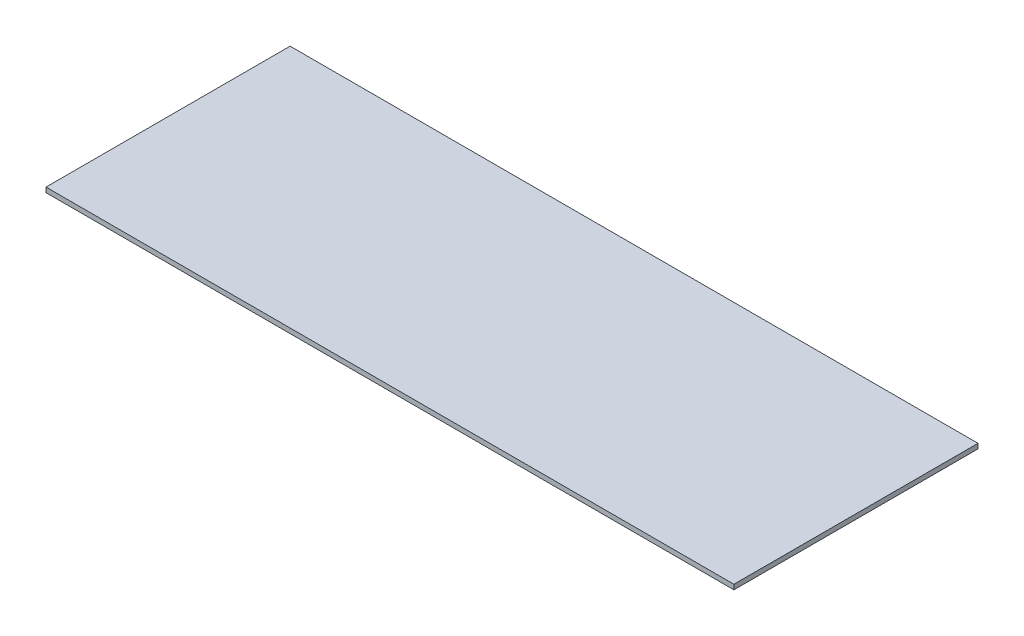
ISO-10303-21;
HEADER;
FILE_DESCRIPTION(('STEP AP214'),'2;1');
FILE_NAME('part.step','',(''),(''),'','','');
FILE_SCHEMA(('AUTOMOTIVE_DESIGN { 1 0 10303 214 1 1 1 1 }'));
ENDSEC;
DATA;
#1=APPLICATION_CONTEXT('core data for automotive mechanical design processes');
#2=APPLICATION_PROTOCOL_DEFINITION('international standard','automotive_design',2000,#1);
#3=PRODUCT_CONTEXT('',#1,'mechanical');
#4=PRODUCT('Part','Part','',(#3));
#5=PRODUCT_RELATED_PRODUCT_CATEGORY('part','',(#4));
#6=PRODUCT_DEFINITION_FORMATION('','',#4);
#7=PRODUCT_DEFINITION_CONTEXT('part definition',#1,'design');
#8=PRODUCT_DEFINITION('design','',#6,#7);
#9=PRODUCT_DEFINITION_SHAPE('','',#8);
#10=(LENGTH_UNIT() NAMED_UNIT(*) SI_UNIT(.MILLI.,.METRE.));
#11=(NAMED_UNIT(*) PLANE_ANGLE_UNIT() SI_UNIT($,.RADIAN.));
#12=(NAMED_UNIT(*) SI_UNIT($,.STERADIAN.) SOLID_ANGLE_UNIT());
#13=UNCERTAINTY_MEASURE_WITH_UNIT(LENGTH_MEASURE(1.E-05),#10,'distance_accuracy_value','');
#14=(GEOMETRIC_REPRESENTATION_CONTEXT(3) GLOBAL_UNCERTAINTY_ASSIGNED_CONTEXT((#13)) GLOBAL_UNIT_ASSIGNED_CONTEXT((#10,
#11,#12)) REPRESENTATION_CONTEXT('',''));
#15=CARTESIAN_POINT('',(0.,0.,0.));
#16=DIRECTION('',(0.,0.,1.));
#17=DIRECTION('',(1.,0.,0.));
#18=AXIS2_PLACEMENT_3D('',#15,#16,#17);
#19=CARTESIAN_POINT('',(393.7,5.55625,139.7));
#20=DIRECTION('',(-1.,0.,0.));
#21=DIRECTION('',(0.,0.,1.));
#22=AXIS2_PLACEMENT_3D('',#19,#20,#21);
#23=PLANE('',#22);
#24=DIRECTION('',(0.,0.,-1.));
#25=VECTOR('',#24,1.);
#26=CARTESIAN_POINT('',(393.7,0.,139.7));
#27=LINE('',#26,#25);
#28=CARTESIAN_POINT('',(393.7,0.,139.7));
#29=VERTEX_POINT('',#28);
#30=CARTESIAN_POINT('',(393.7,0.,-139.7));
#31=VERTEX_POINT('',#30);
#32=EDGE_CURVE('E100',#29,#31,#27,.T.);
#33=ORIENTED_EDGE('',*,*,#32,.T.);
#34=DIRECTION('',(0.,-1.,0.));
#35=VECTOR('',#34,1.);
#36=CARTESIAN_POINT('',(393.7,5.55625,-139.7));
#37=LINE('',#36,#35);
#38=CARTESIAN_POINT('',(393.7,5.55625,-139.7));
#39=VERTEX_POINT('',#38);
#40=EDGE_CURVE('E11',#39,#31,#37,.T.);
#41=ORIENTED_EDGE('',*,*,#40,.F.);
#42=DIRECTION('',(0.,0.,-1.));
#43=VECTOR('',#42,1.);
#44=CARTESIAN_POINT('',(393.7,5.55625,139.7));
#45=LINE('',#44,#43);
#46=CARTESIAN_POINT('',(393.7,5.55625,139.7));
#47=VERTEX_POINT('',#46);
#48=EDGE_CURVE('E88',#47,#39,#45,.T.);
#49=ORIENTED_EDGE('',*,*,#48,.F.);
#50=DIRECTION('',(0.,-1.,0.));
#51=VECTOR('',#50,1.);
#52=CARTESIAN_POINT('',(393.7,5.55625,139.7));
#53=LINE('',#52,#51);
#54=EDGE_CURVE('E96',#47,#29,#53,.T.);
#55=ORIENTED_EDGE('',*,*,#54,.T.);
#56=EDGE_LOOP('',(#33,#41,#49,#55));
#57=FACE_BOUND('',#56,.T.);
#58=ADVANCED_FACE('F37',(#57),#23,.F.);
#59=CARTESIAN_POINT('',(-393.7,5.55625,-139.7));
#60=DIRECTION('',(0.,0.,1.));
#61=DIRECTION('',(1.,0.,0.));
#62=AXIS2_PLACEMENT_3D('',#59,#60,#61);
#63=PLANE('',#62);
#64=DIRECTION('',(-1.,0.,0.));
#65=VECTOR('',#64,1.);
#66=CARTESIAN_POINT('',(-393.7,0.,-139.7));
#67=LINE('',#66,#65);
#68=CARTESIAN_POINT('',(-393.7,0.,-139.7));
#69=VERTEX_POINT('',#68);
#70=EDGE_CURVE('E92',#31,#69,#67,.T.);
#71=ORIENTED_EDGE('',*,*,#70,.T.);
#72=DIRECTION('',(0.,-1.,0.));
#73=VECTOR('',#72,1.);
#74=CARTESIAN_POINT('',(-393.7,5.55625,-139.7));
#75=LINE('',#74,#73);
#76=CARTESIAN_POINT('',(-393.7,5.55625,-139.7));
#77=VERTEX_POINT('',#76);
#78=EDGE_CURVE('E45',#77,#69,#75,.T.);
#79=ORIENTED_EDGE('',*,*,#78,.F.);
#80=DIRECTION('',(-1.,0.,0.));
#81=VECTOR('',#80,1.);
#82=CARTESIAN_POINT('',(-393.7,5.55625,-139.7));
#83=LINE('',#82,#81);
#84=EDGE_CURVE('E83',#39,#77,#83,.T.);
#85=ORIENTED_EDGE('',*,*,#84,.F.);
#86=ORIENTED_EDGE('',*,*,#40,.T.);
#87=EDGE_LOOP('',(#71,#79,#85,#86));
#88=FACE_BOUND('',#87,.T.);
#89=ADVANCED_FACE('F91',(#88),#63,.F.);
#90=CARTESIAN_POINT('',(-393.7,5.55625,139.7));
#91=DIRECTION('',(1.,0.,0.));
#92=DIRECTION('',(0.,0.,-1.));
#93=AXIS2_PLACEMENT_3D('',#90,#91,#92);
#94=PLANE('',#93);
#95=DIRECTION('',(0.,0.,1.));
#96=VECTOR('',#95,1.);
#97=CARTESIAN_POINT('',(-393.7,0.,139.7));
#98=LINE('',#97,#96);
#99=CARTESIAN_POINT('',(-393.7,0.,139.7));
#100=VERTEX_POINT('',#99);
#101=EDGE_CURVE('E70',#69,#100,#98,.T.);
#102=ORIENTED_EDGE('',*,*,#101,.T.);
#103=DIRECTION('',(0.,-1.,0.));
#104=VECTOR('',#103,1.);
#105=CARTESIAN_POINT('',(-393.7,5.55625,139.7));
#106=LINE('',#105,#104);
#107=CARTESIAN_POINT('',(-393.7,5.55625,139.7));
#108=VERTEX_POINT('',#107);
#109=EDGE_CURVE('E93',#108,#100,#106,.T.);
#110=ORIENTED_EDGE('',*,*,#109,.F.);
#111=DIRECTION('',(0.,0.,1.));
#112=VECTOR('',#111,1.);
#113=CARTESIAN_POINT('',(-393.7,5.55625,139.7));
#114=LINE('',#113,#112);
#115=EDGE_CURVE('E86',#77,#108,#114,.T.);
#116=ORIENTED_EDGE('',*,*,#115,.F.);
#117=ORIENTED_EDGE('',*,*,#78,.T.);
#118=EDGE_LOOP('',(#102,#110,#116,#117));
#119=FACE_BOUND('',#118,.T.);
#120=ADVANCED_FACE('F94',(#119),#94,.F.);
#121=CARTESIAN_POINT('',(-393.7,5.55625,139.7));
#122=DIRECTION('',(0.,0.,-1.));
#123=DIRECTION('',(-1.,0.,0.));
#124=AXIS2_PLACEMENT_3D('',#121,#122,#123);
#125=PLANE('',#124);
#126=DIRECTION('',(1.,0.,0.));
#127=VECTOR('',#126,1.);
#128=CARTESIAN_POINT('',(-393.7,0.,139.7));
#129=LINE('',#128,#127);
#130=EDGE_CURVE('E76',#100,#29,#129,.T.);
#131=ORIENTED_EDGE('',*,*,#130,.T.);
#132=ORIENTED_EDGE('',*,*,#54,.F.);
#133=DIRECTION('',(1.,0.,0.));
#134=VECTOR('',#133,1.);
#135=CARTESIAN_POINT('',(-393.7,5.55625,139.7));
#136=LINE('',#135,#134);
#137=EDGE_CURVE('E53',#108,#47,#136,.T.);
#138=ORIENTED_EDGE('',*,*,#137,.F.);
#139=ORIENTED_EDGE('',*,*,#109,.T.);
#140=EDGE_LOOP('',(#131,#132,#138,#139));
#141=FACE_BOUND('',#140,.T.);
#142=ADVANCED_FACE('F107',(#141),#125,.F.);
#143=CARTESIAN_POINT('',(0.,5.55625,0.));
#144=DIRECTION('',(0.,-1.,0.));
#145=DIRECTION('',(0.,0.,-1.));
#146=AXIS2_PLACEMENT_3D('',#143,#144,#145);
#147=PLANE('',#146);
#148=ORIENTED_EDGE('',*,*,#48,.T.);
#149=ORIENTED_EDGE('',*,*,#84,.T.);
#150=ORIENTED_EDGE('',*,*,#115,.T.);
#151=ORIENTED_EDGE('',*,*,#137,.T.);
#152=EDGE_LOOP('',(#148,#149,#150,#151));
#153=FACE_BOUND('',#152,.T.);
#154=ADVANCED_FACE('F84',(#153),#147,.F.);
#155=CARTESIAN_POINT('',(0.,0.,0.));
#156=DIRECTION('',(0.,-1.,0.));
#157=DIRECTION('',(0.,0.,-1.));
#158=AXIS2_PLACEMENT_3D('',#155,#156,#157);
#159=PLANE('',#158);
#160=ORIENTED_EDGE('',*,*,#32,.F.);
#161=ORIENTED_EDGE('',*,*,#130,.F.);
#162=ORIENTED_EDGE('',*,*,#101,.F.);
#163=ORIENTED_EDGE('',*,*,#70,.F.);
#164=EDGE_LOOP('',(#160,#161,#162,#163));
#165=FACE_BOUND('',#164,.T.);
#166=ADVANCED_FACE('F110',(#165),#159,.T.);
#167=CLOSED_SHELL('',(#58,#89,#120,#142,#154,#166));
#168=MANIFOLD_SOLID_BREP('B2',#167);
#169=ADVANCED_BREP_SHAPE_REPRESENTATION('',(#18,#168),#14);
#170=SHAPE_DEFINITION_REPRESENTATION(#9,#169);
ENDSEC;
END-ISO-10303-21;
